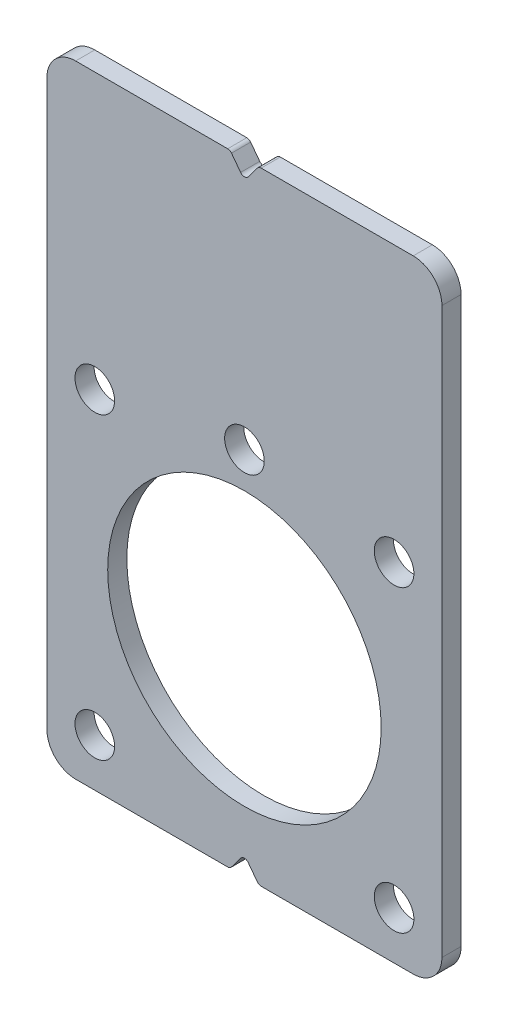
ISO-10303-21;
HEADER;
FILE_DESCRIPTION(('STEP AP214'),'2;1');
FILE_NAME('part.step','',(''),(''),'','','');
FILE_SCHEMA(('AUTOMOTIVE_DESIGN { 1 0 10303 214 1 1 1 1 }'));
ENDSEC;
DATA;
#1=APPLICATION_CONTEXT('core data for automotive mechanical design processes');
#2=APPLICATION_PROTOCOL_DEFINITION('international standard','automotive_design',2000,#1);
#3=PRODUCT_CONTEXT('',#1,'mechanical');
#4=PRODUCT('Part','Part','',(#3));
#5=PRODUCT_RELATED_PRODUCT_CATEGORY('part','',(#4));
#6=PRODUCT_DEFINITION_FORMATION('','',#4);
#7=PRODUCT_DEFINITION_CONTEXT('part definition',#1,'design');
#8=PRODUCT_DEFINITION('design','',#6,#7);
#9=PRODUCT_DEFINITION_SHAPE('','',#8);
#10=(LENGTH_UNIT() NAMED_UNIT(*) SI_UNIT(.MILLI.,.METRE.));
#11=(NAMED_UNIT(*) PLANE_ANGLE_UNIT() SI_UNIT($,.RADIAN.));
#12=(NAMED_UNIT(*) SI_UNIT($,.STERADIAN.) SOLID_ANGLE_UNIT());
#13=UNCERTAINTY_MEASURE_WITH_UNIT(LENGTH_MEASURE(1.E-05),#10,'distance_accuracy_value','');
#14=(GEOMETRIC_REPRESENTATION_CONTEXT(3) GLOBAL_UNCERTAINTY_ASSIGNED_CONTEXT((#13)) GLOBAL_UNIT_ASSIGNED_CONTEXT((#10,
#11,#12)) REPRESENTATION_CONTEXT('',''));
#15=CARTESIAN_POINT('',(0.,0.,0.));
#16=DIRECTION('',(0.,0.,1.));
#17=DIRECTION('',(1.,0.,0.));
#18=AXIS2_PLACEMENT_3D('',#15,#16,#17);
#19=CARTESIAN_POINT('',(0.,-20.6375,1.));
#20=DIRECTION('',(0.,1.,0.));
#21=DIRECTION('',(0.,0.,1.));
#22=AXIS2_PLACEMENT_3D('',#19,#20,#21);
#23=PLANE('',#22);
#24=DIRECTION('',(1.,0.,0.));
#25=VECTOR('',#24,1.);
#26=CARTESIAN_POINT('',(0.,-20.6375,-1.));
#27=LINE('',#26,#25);
#28=CARTESIAN_POINT('',(-17.6375,-20.6375,-1.));
#29=VERTEX_POINT('',#28);
#30=CARTESIAN_POINT('',(-1.74999999999999,-20.6375,-1.));
#31=VERTEX_POINT('',#30);
#32=EDGE_CURVE('E190',#29,#31,#27,.T.);
#33=ORIENTED_EDGE('',*,*,#32,.T.);
#34=DIRECTION('',(0.,0.,1.));
#35=VECTOR('',#34,1.);
#36=CARTESIAN_POINT('',(-1.74999999999999,-20.6375,1.));
#37=LINE('',#36,#35);
#38=CARTESIAN_POINT('',(-1.74999999999999,-20.6375,1.));
#39=VERTEX_POINT('',#38);
#40=EDGE_CURVE('E269',#31,#39,#37,.T.);
#41=ORIENTED_EDGE('',*,*,#40,.T.);
#42=DIRECTION('',(1.,0.,0.));
#43=VECTOR('',#42,1.);
#44=CARTESIAN_POINT('',(0.,-20.6375,1.));
#45=LINE('',#44,#43);
#46=CARTESIAN_POINT('',(-17.6375,-20.6375,1.));
#47=VERTEX_POINT('',#46);
#48=EDGE_CURVE('E193',#47,#39,#45,.T.);
#49=ORIENTED_EDGE('',*,*,#48,.F.);
#50=DIRECTION('',(0.,0.,-1.));
#51=VECTOR('',#50,1.);
#52=CARTESIAN_POINT('',(-17.6375,-20.6375,1.));
#53=LINE('',#52,#51);
#54=EDGE_CURVE('E178',#47,#29,#53,.T.);
#55=ORIENTED_EDGE('',*,*,#54,.T.);
#56=EDGE_LOOP('',(#33,#41,#49,#55));
#57=FACE_BOUND('',#56,.T.);
#58=ADVANCED_FACE('F36',(#57),#23,.F.);
#59=CARTESIAN_POINT('',(0.,44.3625,1.));
#60=DIRECTION('',(0.,1.,0.));
#61=DIRECTION('',(0.,0.,1.));
#62=AXIS2_PLACEMENT_3D('',#59,#60,#61);
#63=PLANE('',#62);
#64=DIRECTION('',(1.,0.,0.));
#65=VECTOR('',#64,1.);
#66=CARTESIAN_POINT('',(0.,44.3625,-1.));
#67=LINE('',#66,#65);
#68=CARTESIAN_POINT('',(1.74999999999999,44.3625,-1.));
#69=VERTEX_POINT('',#68);
#70=CARTESIAN_POINT('',(17.6375,44.3625,-1.));
#71=VERTEX_POINT('',#70);
#72=EDGE_CURVE('E205',#69,#71,#67,.T.);
#73=ORIENTED_EDGE('',*,*,#72,.F.);
#74=DIRECTION('',(0.,0.,1.));
#75=VECTOR('',#74,1.);
#76=CARTESIAN_POINT('',(1.74999999999999,44.3625,1.));
#77=LINE('',#76,#75);
#78=CARTESIAN_POINT('',(1.74999999999999,44.3625,1.));
#79=VERTEX_POINT('',#78);
#80=EDGE_CURVE('E275',#69,#79,#77,.T.);
#81=ORIENTED_EDGE('',*,*,#80,.T.);
#82=DIRECTION('',(1.,0.,0.));
#83=VECTOR('',#82,1.);
#84=CARTESIAN_POINT('',(0.,44.3625,1.));
#85=LINE('',#84,#83);
#86=CARTESIAN_POINT('',(17.6375,44.3625,1.));
#87=VERTEX_POINT('',#86);
#88=EDGE_CURVE('E360',#79,#87,#85,.T.);
#89=ORIENTED_EDGE('',*,*,#88,.T.);
#90=DIRECTION('',(0.,0.,-1.));
#91=VECTOR('',#90,1.);
#92=CARTESIAN_POINT('',(17.6375,44.3625,1.));
#93=LINE('',#92,#91);
#94=EDGE_CURVE('E234',#87,#71,#93,.T.);
#95=ORIENTED_EDGE('',*,*,#94,.T.);
#96=EDGE_LOOP('',(#73,#81,#89,#95));
#97=FACE_BOUND('',#96,.T.);
#98=ADVANCED_FACE('F385',(#97),#63,.T.);
#99=CARTESIAN_POINT('',(1.74999999999999,-20.6375,1.));
#100=VERTEX_POINT('',#99);
#101=CARTESIAN_POINT('',(17.6375,-20.6375,1.));
#102=VERTEX_POINT('',#101);
#103=EDGE_CURVE('E355',#100,#102,#45,.T.);
#104=ORIENTED_EDGE('',*,*,#103,.F.);
#105=DIRECTION('',(0.,0.,1.));
#106=VECTOR('',#105,1.);
#107=CARTESIAN_POINT('',(1.74999999999999,-20.6375,1.));
#108=LINE('',#107,#106);
#109=CARTESIAN_POINT('',(1.74999999999999,-20.6375,-1.));
#110=VERTEX_POINT('',#109);
#111=EDGE_CURVE('E260',#100,#110,#108,.F.);
#112=ORIENTED_EDGE('',*,*,#111,.T.);
#113=CARTESIAN_POINT('',(17.6375,-20.6375,-1.));
#114=VERTEX_POINT('',#113);
#115=EDGE_CURVE('E202',#110,#114,#27,.T.);
#116=ORIENTED_EDGE('',*,*,#115,.T.);
#117=DIRECTION('',(0.,0.,-1.));
#118=VECTOR('',#117,1.);
#119=CARTESIAN_POINT('',(17.6375,-20.6375,1.));
#120=LINE('',#119,#118);
#121=EDGE_CURVE('E242',#114,#102,#120,.F.);
#122=ORIENTED_EDGE('',*,*,#121,.T.);
#123=EDGE_LOOP('',(#104,#112,#116,#122));
#124=FACE_BOUND('',#123,.T.);
#125=ADVANCED_FACE('F387',(#124),#23,.F.);
#126=CARTESIAN_POINT('',(20.6375,0.,1.));
#127=DIRECTION('',(1.,0.,0.));
#128=DIRECTION('',(0.,1.,0.));
#129=AXIS2_PLACEMENT_3D('',#126,#127,#128);
#130=PLANE('',#129);
#131=DIRECTION('',(0.,-1.,0.));
#132=VECTOR('',#131,1.);
#133=CARTESIAN_POINT('',(20.6375,0.,-1.));
#134=LINE('',#133,#132);
#135=CARTESIAN_POINT('',(20.6375,41.3625,-1.));
#136=VERTEX_POINT('',#135);
#137=CARTESIAN_POINT('',(20.6375,-17.6375,-1.));
#138=VERTEX_POINT('',#137);
#139=EDGE_CURVE('E201',#136,#138,#134,.T.);
#140=ORIENTED_EDGE('',*,*,#139,.F.);
#141=DIRECTION('',(0.,0.,-1.));
#142=VECTOR('',#141,1.);
#143=CARTESIAN_POINT('',(20.6375,41.3625,1.));
#144=LINE('',#143,#142);
#145=CARTESIAN_POINT('',(20.6375,41.3625,1.));
#146=VERTEX_POINT('',#145);
#147=EDGE_CURVE('E240',#136,#146,#144,.F.);
#148=ORIENTED_EDGE('',*,*,#147,.T.);
#149=DIRECTION('',(0.,-1.,0.));
#150=VECTOR('',#149,1.);
#151=CARTESIAN_POINT('',(20.6375,0.,1.));
#152=LINE('',#151,#150);
#153=CARTESIAN_POINT('',(20.6375,-17.6375,1.));
#154=VERTEX_POINT('',#153);
#155=EDGE_CURVE('E357',#146,#154,#152,.T.);
#156=ORIENTED_EDGE('',*,*,#155,.T.);
#157=DIRECTION('',(0.,0.,-1.));
#158=VECTOR('',#157,1.);
#159=CARTESIAN_POINT('',(20.6375,-17.6375,-1.));
#160=LINE('',#159,#158);
#161=EDGE_CURVE('E237',#154,#138,#160,.T.);
#162=ORIENTED_EDGE('',*,*,#161,.T.);
#163=EDGE_LOOP('',(#140,#148,#156,#162));
#164=FACE_BOUND('',#163,.T.);
#165=ADVANCED_FACE('F396',(#164),#130,.T.);
#166=CARTESIAN_POINT('',(-17.6375,44.3625,1.));
#167=VERTEX_POINT('',#166);
#168=CARTESIAN_POINT('',(-1.74999999999999,44.3625,1.));
#169=VERTEX_POINT('',#168);
#170=EDGE_CURVE('E361',#167,#169,#85,.T.);
#171=ORIENTED_EDGE('',*,*,#170,.T.);
#172=DIRECTION('',(0.,0.,1.));
#173=VECTOR('',#172,1.);
#174=CARTESIAN_POINT('',(-1.74999999999999,44.3625,-1.));
#175=LINE('',#174,#173);
#176=CARTESIAN_POINT('',(-1.74999999999999,44.3625,-1.));
#177=VERTEX_POINT('',#176);
#178=EDGE_CURVE('E288',#169,#177,#175,.F.);
#179=ORIENTED_EDGE('',*,*,#178,.T.);
#180=CARTESIAN_POINT('',(-17.6375,44.3625,-1.));
#181=VERTEX_POINT('',#180);
#182=EDGE_CURVE('E211',#181,#177,#67,.T.);
#183=ORIENTED_EDGE('',*,*,#182,.F.);
#184=DIRECTION('',(0.,0.,-1.));
#185=VECTOR('',#184,1.);
#186=CARTESIAN_POINT('',(-17.6375,44.3625,1.));
#187=LINE('',#186,#185);
#188=EDGE_CURVE('E245',#181,#167,#187,.F.);
#189=ORIENTED_EDGE('',*,*,#188,.T.);
#190=EDGE_LOOP('',(#171,#179,#183,#189));
#191=FACE_BOUND('',#190,.T.);
#192=ADVANCED_FACE('F376',(#191),#63,.T.);
#193=CARTESIAN_POINT('',(0.,0.,1.));
#194=DIRECTION('',(0.,0.,-1.));
#195=DIRECTION('',(-1.,0.,0.));
#196=AXIS2_PLACEMENT_3D('',#193,#194,#195);
#197=CYLINDRICAL_SURFACE('',#196,14.2875);
#198=CARTESIAN_POINT('',(0.,0.,1.));
#199=DIRECTION('',(0.,0.,1.));
#200=DIRECTION('',(1.,0.,0.));
#201=AXIS2_PLACEMENT_3D('',#198,#199,#200);
#202=CIRCLE('',#201,14.2875);
#203=CARTESIAN_POINT('',(14.2875,0.,1.));
#204=VERTEX_POINT('',#203);
#205=EDGE_CURVE('E215',#204,#204,#202,.T.);
#206=ORIENTED_EDGE('',*,*,#205,.T.);
#207=EDGE_LOOP('',(#206));
#208=FACE_BOUND('',#207,.T.);
#209=CARTESIAN_POINT('',(0.,0.,-1.));
#210=DIRECTION('',(0.,0.,1.));
#211=DIRECTION('',(1.,0.,0.));
#212=AXIS2_PLACEMENT_3D('',#209,#210,#211);
#213=CIRCLE('',#212,14.2875);
#214=CARTESIAN_POINT('',(14.2875,0.,-1.));
#215=VERTEX_POINT('',#214);
#216=EDGE_CURVE('E207',#215,#215,#213,.T.);
#217=ORIENTED_EDGE('',*,*,#216,.F.);
#218=EDGE_LOOP('',(#217));
#219=FACE_BOUND('',#218,.T.);
#220=ADVANCED_FACE('F468',(#208,#219),#197,.F.);
#221=CARTESIAN_POINT('',(-20.6375,0.,1.));
#222=DIRECTION('',(1.,0.,0.));
#223=DIRECTION('',(0.,1.,0.));
#224=AXIS2_PLACEMENT_3D('',#221,#222,#223);
#225=PLANE('',#224);
#226=DIRECTION('',(0.,-1.,0.));
#227=VECTOR('',#226,1.);
#228=CARTESIAN_POINT('',(-20.6375,0.,-1.));
#229=LINE('',#228,#227);
#230=CARTESIAN_POINT('',(-20.6375,41.3625,-1.));
#231=VERTEX_POINT('',#230);
#232=CARTESIAN_POINT('',(-20.6375,-17.6375,-1.));
#233=VERTEX_POINT('',#232);
#234=EDGE_CURVE('E214',#231,#233,#229,.T.);
#235=ORIENTED_EDGE('',*,*,#234,.T.);
#236=DIRECTION('',(0.,0.,-1.));
#237=VECTOR('',#236,1.);
#238=CARTESIAN_POINT('',(-20.6375,-17.6375,1.));
#239=LINE('',#238,#237);
#240=CARTESIAN_POINT('',(-20.6375,-17.6375,1.));
#241=VERTEX_POINT('',#240);
#242=EDGE_CURVE('E179',#233,#241,#239,.F.);
#243=ORIENTED_EDGE('',*,*,#242,.T.);
#244=DIRECTION('',(0.,-1.,0.));
#245=VECTOR('',#244,1.);
#246=CARTESIAN_POINT('',(-20.6375,0.,1.));
#247=LINE('',#246,#245);
#248=CARTESIAN_POINT('',(-20.6375,41.3625,1.));
#249=VERTEX_POINT('',#248);
#250=EDGE_CURVE('E195',#249,#241,#247,.T.);
#251=ORIENTED_EDGE('',*,*,#250,.F.);
#252=DIRECTION('',(0.,0.,-1.));
#253=VECTOR('',#252,1.);
#254=CARTESIAN_POINT('',(-20.6375,41.3625,-1.));
#255=LINE('',#254,#253);
#256=EDGE_CURVE('E183',#249,#231,#255,.T.);
#257=ORIENTED_EDGE('',*,*,#256,.T.);
#258=EDGE_LOOP('',(#235,#243,#251,#257));
#259=FACE_BOUND('',#258,.T.);
#260=ADVANCED_FACE('F369',(#259),#225,.F.);
#261=CARTESIAN_POINT('',(0.,0.,1.));
#262=DIRECTION('',(0.,0.,1.));
#263=DIRECTION('',(1.,0.,0.));
#264=AXIS2_PLACEMENT_3D('',#261,#262,#263);
#265=PLANE('',#264);
#266=CARTESIAN_POINT('',(15.6375,-15.6375,1.));
#267=DIRECTION('',(0.,0.,1.));
#268=DIRECTION('',(1.,0.,0.));
#269=AXIS2_PLACEMENT_3D('',#266,#267,#268);
#270=CIRCLE('',#269,2.07);
#271=CARTESIAN_POINT('',(17.7075,-15.6375,1.));
#272=VERTEX_POINT('',#271);
#273=EDGE_CURVE('E350',#272,#272,#270,.T.);
#274=ORIENTED_EDGE('',*,*,#273,.F.);
#275=EDGE_LOOP('',(#274));
#276=FACE_BOUND('',#275,.T.);
#277=DIRECTION('',(-0.599999999999998,0.800000000000001,0.));
#278=VECTOR('',#277,1.);
#279=CARTESIAN_POINT('',(-8.94599999999999,-6.70949999999996,1.));
#280=LINE('',#279,#278);
#281=CARTESIAN_POINT('',(1.34999999999999,-20.4375,1.));
#282=VERTEX_POINT('',#281);
#283=CARTESIAN_POINT('',(0.400000000000001,-19.1708333333333,1.));
#284=VERTEX_POINT('',#283);
#285=EDGE_CURVE('E345',#282,#284,#280,.T.);
#286=ORIENTED_EDGE('',*,*,#285,.F.);
#287=CARTESIAN_POINT('',(1.74999999999999,-20.1375,1.));
#288=DIRECTION('',(0.,0.,1.));
#289=DIRECTION('',(1.,0.,0.));
#290=AXIS2_PLACEMENT_3D('',#287,#288,#289);
#291=CIRCLE('',#290,0.5);
#292=EDGE_CURVE('E258',#282,#100,#291,.T.);
#293=ORIENTED_EDGE('',*,*,#292,.T.);
#294=ORIENTED_EDGE('',*,*,#103,.T.);
#295=CARTESIAN_POINT('',(17.6375,-17.6375,1.));
#296=DIRECTION('',(0.,0.,1.));
#297=DIRECTION('',(1.,0.,0.));
#298=AXIS2_PLACEMENT_3D('',#295,#296,#297);
#299=CIRCLE('',#298,3.);
#300=EDGE_CURVE('E227',#102,#154,#299,.T.);
#301=ORIENTED_EDGE('',*,*,#300,.T.);
#302=ORIENTED_EDGE('',*,*,#155,.F.);
#303=CARTESIAN_POINT('',(17.6375,41.3625,1.));
#304=DIRECTION('',(0.,0.,1.));
#305=DIRECTION('',(1.,0.,0.));
#306=AXIS2_PLACEMENT_3D('',#303,#304,#305);
#307=CIRCLE('',#306,3.);
#308=EDGE_CURVE('E229',#146,#87,#307,.T.);
#309=ORIENTED_EDGE('',*,*,#308,.T.);
#310=ORIENTED_EDGE('',*,*,#88,.F.);
#311=CARTESIAN_POINT('',(1.74999999999999,43.8625,1.));
#312=DIRECTION('',(0.,0.,1.));
#313=DIRECTION('',(1.,0.,0.));
#314=AXIS2_PLACEMENT_3D('',#311,#312,#313);
#315=CIRCLE('',#314,0.5);
#316=CARTESIAN_POINT('',(1.35,44.1625,1.));
#317=VERTEX_POINT('',#316);
#318=EDGE_CURVE('E254',#79,#317,#315,.T.);
#319=ORIENTED_EDGE('',*,*,#318,.T.);
#320=DIRECTION('',(0.599999999999998,0.800000000000001,0.));
#321=VECTOR('',#320,1.);
#322=CARTESIAN_POINT('',(-20.334,15.2504999999999,1.));
#323=LINE('',#322,#321);
#324=CARTESIAN_POINT('',(0.400000000000008,42.8958333333333,1.));
#325=VERTEX_POINT('',#324);
#326=EDGE_CURVE('E301',#325,#317,#323,.T.);
#327=ORIENTED_EDGE('',*,*,#326,.F.);
#328=CARTESIAN_POINT('',(0.,43.1958333333333,1.));
#329=DIRECTION('',(0.,0.,1.));
#330=DIRECTION('',(1.,0.,0.));
#331=AXIS2_PLACEMENT_3D('',#328,#329,#330);
#332=CIRCLE('',#331,0.5);
#333=CARTESIAN_POINT('',(-0.400000000000005,42.8958333333333,1.));
#334=VERTEX_POINT('',#333);
#335=EDGE_CURVE('E44',#325,#334,#332,.F.);
#336=ORIENTED_EDGE('',*,*,#335,.T.);
#337=DIRECTION('',(0.599999999999998,-0.800000000000001,0.));
#338=VECTOR('',#337,1.);
#339=CARTESIAN_POINT('',(20.334,15.2504999999999,1.));
#340=LINE('',#339,#338);
#341=CARTESIAN_POINT('',(-1.34999999999999,44.1625,1.));
#342=VERTEX_POINT('',#341);
#343=EDGE_CURVE('E299',#342,#334,#340,.T.);
#344=ORIENTED_EDGE('',*,*,#343,.F.);
#345=CARTESIAN_POINT('',(-1.74999999999999,43.8625,1.));
#346=DIRECTION('',(0.,0.,1.));
#347=DIRECTION('',(1.,0.,0.));
#348=AXIS2_PLACEMENT_3D('',#345,#346,#347);
#349=CIRCLE('',#348,0.5);
#350=EDGE_CURVE('E252',#342,#169,#349,.T.);
#351=ORIENTED_EDGE('',*,*,#350,.T.);
#352=ORIENTED_EDGE('',*,*,#170,.F.);
#353=CARTESIAN_POINT('',(-17.6375,41.3625,1.));
#354=DIRECTION('',(0.,0.,1.));
#355=DIRECTION('',(1.,0.,0.));
#356=AXIS2_PLACEMENT_3D('',#353,#354,#355);
#357=CIRCLE('',#356,3.);
#358=EDGE_CURVE('E225',#167,#249,#357,.T.);
#359=ORIENTED_EDGE('',*,*,#358,.T.);
#360=ORIENTED_EDGE('',*,*,#250,.T.);
#361=CARTESIAN_POINT('',(-17.6375,-17.6375,1.));
#362=DIRECTION('',(0.,0.,1.));
#363=DIRECTION('',(1.,0.,0.));
#364=AXIS2_PLACEMENT_3D('',#361,#362,#363);
#365=CIRCLE('',#364,3.);
#366=EDGE_CURVE('E232',#241,#47,#365,.T.);
#367=ORIENTED_EDGE('',*,*,#366,.T.);
#368=ORIENTED_EDGE('',*,*,#48,.T.);
#369=CARTESIAN_POINT('',(-1.74999999999999,-20.1375,1.));
#370=DIRECTION('',(0.,0.,1.));
#371=DIRECTION('',(1.,0.,0.));
#372=AXIS2_PLACEMENT_3D('',#369,#370,#371);
#373=CIRCLE('',#372,0.5);
#374=CARTESIAN_POINT('',(-1.34999999999999,-20.4375,1.));
#375=VERTEX_POINT('',#374);
#376=EDGE_CURVE('E256',#39,#375,#373,.T.);
#377=ORIENTED_EDGE('',*,*,#376,.T.);
#378=DIRECTION('',(-0.599999999999998,-0.800000000000001,0.));
#379=VECTOR('',#378,1.);
#380=CARTESIAN_POINT('',(8.94599999999999,-6.70949999999997,1.));
#381=LINE('',#380,#379);
#382=CARTESIAN_POINT('',(-0.400000000000001,-19.1708333333333,1.));
#383=VERTEX_POINT('',#382);
#384=EDGE_CURVE('E348',#383,#375,#381,.T.);
#385=ORIENTED_EDGE('',*,*,#384,.F.);
#386=CARTESIAN_POINT('',(0.,-19.4708333333333,1.));
#387=DIRECTION('',(0.,0.,1.));
#388=DIRECTION('',(1.,0.,0.));
#389=AXIS2_PLACEMENT_3D('',#386,#387,#388);
#390=CIRCLE('',#389,0.5);
#391=EDGE_CURVE('E290',#383,#284,#390,.F.);
#392=ORIENTED_EDGE('',*,*,#391,.T.);
#393=EDGE_LOOP('',(#286,#293,#294,#301,#302,#309,#310,#319,#327,#336,#344,#351,#352,#359,#360,
#367,#368,#377,#385,#392));
#394=FACE_BOUND('',#393,.T.);
#395=CARTESIAN_POINT('',(-15.6375,-15.6375,1.));
#396=DIRECTION('',(0.,0.,1.));
#397=DIRECTION('',(1.,0.,0.));
#398=AXIS2_PLACEMENT_3D('',#395,#396,#397);
#399=CIRCLE('',#398,2.07);
#400=CARTESIAN_POINT('',(-13.5675,-15.6375,1.));
#401=VERTEX_POINT('',#400);
#402=EDGE_CURVE('E342',#401,#401,#399,.T.);
#403=ORIENTED_EDGE('',*,*,#402,.F.);
#404=EDGE_LOOP('',(#403));
#405=FACE_BOUND('',#404,.T.);
#406=CARTESIAN_POINT('',(15.6375,15.6375,1.));
#407=DIRECTION('',(0.,0.,1.));
#408=DIRECTION('',(1.,0.,0.));
#409=AXIS2_PLACEMENT_3D('',#406,#407,#408);
#410=CIRCLE('',#409,2.07);
#411=CARTESIAN_POINT('',(17.7075,15.6375,1.));
#412=VERTEX_POINT('',#411);
#413=EDGE_CURVE('E310',#412,#412,#410,.T.);
#414=ORIENTED_EDGE('',*,*,#413,.F.);
#415=EDGE_LOOP('',(#414));
#416=FACE_BOUND('',#415,.T.);
#417=CARTESIAN_POINT('',(-15.6375,15.6375,1.));
#418=DIRECTION('',(0.,0.,1.));
#419=DIRECTION('',(1.,0.,0.));
#420=AXIS2_PLACEMENT_3D('',#417,#418,#419);
#421=CIRCLE('',#420,2.07);
#422=CARTESIAN_POINT('',(-13.5675,15.6375,1.));
#423=VERTEX_POINT('',#422);
#424=EDGE_CURVE('E336',#423,#423,#421,.T.);
#425=ORIENTED_EDGE('',*,*,#424,.F.);
#426=EDGE_LOOP('',(#425));
#427=FACE_BOUND('',#426,.T.);
#428=CARTESIAN_POINT('',(0.,18.,1.));
#429=DIRECTION('',(0.,0.,1.));
#430=DIRECTION('',(1.,0.,0.));
#431=AXIS2_PLACEMENT_3D('',#428,#429,#430);
#432=CIRCLE('',#431,2.07);
#433=CARTESIAN_POINT('',(2.07,18.,1.));
#434=VERTEX_POINT('',#433);
#435=EDGE_CURVE('E325',#434,#434,#432,.T.);
#436=ORIENTED_EDGE('',*,*,#435,.F.);
#437=EDGE_LOOP('',(#436));
#438=FACE_BOUND('',#437,.T.);
#439=ORIENTED_EDGE('',*,*,#205,.F.);
#440=EDGE_LOOP('',(#439));
#441=FACE_BOUND('',#440,.T.);
#442=ADVANCED_FACE('F297',(#276,#394,#405,#416,#427,#438,#441),#265,.T.);
#443=CARTESIAN_POINT('',(0.,0.,-1.));
#444=DIRECTION('',(0.,0.,1.));
#445=DIRECTION('',(1.,0.,0.));
#446=AXIS2_PLACEMENT_3D('',#443,#444,#445);
#447=PLANE('',#446);
#448=CARTESIAN_POINT('',(15.6375,-15.6375,-1.));
#449=DIRECTION('',(0.,0.,1.));
#450=DIRECTION('',(-1.,0.,0.));
#451=AXIS2_PLACEMENT_3D('',#448,#449,#450);
#452=CIRCLE('',#451,2.07);
#453=CARTESIAN_POINT('',(13.5675,-15.6375,-1.));
#454=VERTEX_POINT('',#453);
#455=EDGE_CURVE('E415',#454,#454,#452,.T.);
#456=ORIENTED_EDGE('',*,*,#455,.T.);
#457=EDGE_LOOP('',(#456));
#458=FACE_BOUND('',#457,.T.);
#459=CARTESIAN_POINT('',(-15.6375,-15.6375,-1.));
#460=DIRECTION('',(0.,0.,1.));
#461=DIRECTION('',(1.,0.,0.));
#462=AXIS2_PLACEMENT_3D('',#459,#460,#461);
#463=CIRCLE('',#462,2.07);
#464=CARTESIAN_POINT('',(-13.5675,-15.6375,-1.));
#465=VERTEX_POINT('',#464);
#466=EDGE_CURVE('E327',#465,#465,#463,.T.);
#467=ORIENTED_EDGE('',*,*,#466,.T.);
#468=EDGE_LOOP('',(#467));
#469=FACE_BOUND('',#468,.T.);
#470=CARTESIAN_POINT('',(15.6375,15.6375,-1.));
#471=DIRECTION('',(0.,0.,1.));
#472=DIRECTION('',(1.,0.,0.));
#473=AXIS2_PLACEMENT_3D('',#470,#471,#472);
#474=CIRCLE('',#473,2.07);
#475=CARTESIAN_POINT('',(17.7075,15.6375,-1.));
#476=VERTEX_POINT('',#475);
#477=EDGE_CURVE('E419',#476,#476,#474,.T.);
#478=ORIENTED_EDGE('',*,*,#477,.T.);
#479=EDGE_LOOP('',(#478));
#480=FACE_BOUND('',#479,.T.);
#481=CARTESIAN_POINT('',(-15.6375,15.6375,-1.));
#482=DIRECTION('',(0.,0.,1.));
#483=DIRECTION('',(-1.,0.,0.));
#484=AXIS2_PLACEMENT_3D('',#481,#482,#483);
#485=CIRCLE('',#484,2.07);
#486=CARTESIAN_POINT('',(-17.7075,15.6375,-1.));
#487=VERTEX_POINT('',#486);
#488=EDGE_CURVE('E421',#487,#487,#485,.T.);
#489=ORIENTED_EDGE('',*,*,#488,.T.);
#490=EDGE_LOOP('',(#489));
#491=FACE_BOUND('',#490,.T.);
#492=CARTESIAN_POINT('',(0.,18.,-1.));
#493=DIRECTION('',(0.,0.,1.));
#494=DIRECTION('',(1.,0.,0.));
#495=AXIS2_PLACEMENT_3D('',#492,#493,#494);
#496=CIRCLE('',#495,2.07);
#497=CARTESIAN_POINT('',(2.07,18.,-1.));
#498=VERTEX_POINT('',#497);
#499=EDGE_CURVE('E322',#498,#498,#496,.T.);
#500=ORIENTED_EDGE('',*,*,#499,.T.);
#501=EDGE_LOOP('',(#500));
#502=FACE_BOUND('',#501,.T.);
#503=ORIENTED_EDGE('',*,*,#216,.T.);
#504=EDGE_LOOP('',(#503));
#505=FACE_BOUND('',#504,.T.);
#506=ORIENTED_EDGE('',*,*,#115,.F.);
#507=CARTESIAN_POINT('',(1.74999999999999,-20.1375,-1.));
#508=DIRECTION('',(0.,0.,1.));
#509=DIRECTION('',(1.,0.,0.));
#510=AXIS2_PLACEMENT_3D('',#507,#508,#509);
#511=CIRCLE('',#510,0.5);
#512=CARTESIAN_POINT('',(1.34999999999999,-20.4375,-1.));
#513=VERTEX_POINT('',#512);
#514=EDGE_CURVE('E267',#110,#513,#511,.F.);
#515=ORIENTED_EDGE('',*,*,#514,.T.);
#516=DIRECTION('',(-0.599999999999998,0.800000000000001,0.));
#517=VECTOR('',#516,1.);
#518=CARTESIAN_POINT('',(1.5,-20.6375,-1.));
#519=LINE('',#518,#517);
#520=CARTESIAN_POINT('',(0.400000000000001,-19.1708333333333,-1.));
#521=VERTEX_POINT('',#520);
#522=EDGE_CURVE('E411',#513,#521,#519,.T.);
#523=ORIENTED_EDGE('',*,*,#522,.T.);
#524=CARTESIAN_POINT('',(0.,-19.4708333333333,-1.));
#525=DIRECTION('',(0.,0.,1.));
#526=DIRECTION('',(1.,0.,0.));
#527=AXIS2_PLACEMENT_3D('',#524,#525,#526);
#528=CIRCLE('',#527,0.5);
#529=CARTESIAN_POINT('',(-0.400000000000001,-19.1708333333333,-1.));
#530=VERTEX_POINT('',#529);
#531=EDGE_CURVE('E58',#521,#530,#528,.T.);
#532=ORIENTED_EDGE('',*,*,#531,.T.);
#533=DIRECTION('',(-0.599999999999998,-0.800000000000001,0.));
#534=VECTOR('',#533,1.);
#535=CARTESIAN_POINT('',(-1.5,-20.6375,-1.));
#536=LINE('',#535,#534);
#537=CARTESIAN_POINT('',(-1.34999999999999,-20.4375,-1.));
#538=VERTEX_POINT('',#537);
#539=EDGE_CURVE('E332',#530,#538,#536,.T.);
#540=ORIENTED_EDGE('',*,*,#539,.T.);
#541=CARTESIAN_POINT('',(-1.74999999999999,-20.1375,-1.));
#542=DIRECTION('',(0.,0.,1.));
#543=DIRECTION('',(1.,0.,0.));
#544=AXIS2_PLACEMENT_3D('',#541,#542,#543);
#545=CIRCLE('',#544,0.5);
#546=EDGE_CURVE('E200',#538,#31,#545,.F.);
#547=ORIENTED_EDGE('',*,*,#546,.T.);
#548=ORIENTED_EDGE('',*,*,#32,.F.);
#549=CARTESIAN_POINT('',(-17.6375,-17.6375,-1.));
#550=DIRECTION('',(0.,0.,1.));
#551=DIRECTION('',(1.,0.,0.));
#552=AXIS2_PLACEMENT_3D('',#549,#550,#551);
#553=CIRCLE('',#552,3.);
#554=EDGE_CURVE('E174',#29,#233,#553,.F.);
#555=ORIENTED_EDGE('',*,*,#554,.T.);
#556=ORIENTED_EDGE('',*,*,#234,.F.);
#557=CARTESIAN_POINT('',(-17.6375,41.3625,-1.));
#558=DIRECTION('',(0.,0.,1.));
#559=DIRECTION('',(1.,0.,0.));
#560=AXIS2_PLACEMENT_3D('',#557,#558,#559);
#561=CIRCLE('',#560,3.);
#562=EDGE_CURVE('E194',#231,#181,#561,.F.);
#563=ORIENTED_EDGE('',*,*,#562,.T.);
#564=ORIENTED_EDGE('',*,*,#182,.T.);
#565=CARTESIAN_POINT('',(-1.74999999999999,43.8625,-1.));
#566=DIRECTION('',(0.,0.,1.));
#567=DIRECTION('',(1.,0.,0.));
#568=AXIS2_PLACEMENT_3D('',#565,#566,#567);
#569=CIRCLE('',#568,0.5);
#570=CARTESIAN_POINT('',(-1.34999999999999,44.1625,-1.));
#571=VERTEX_POINT('',#570);
#572=EDGE_CURVE('E262',#177,#571,#569,.F.);
#573=ORIENTED_EDGE('',*,*,#572,.T.);
#574=DIRECTION('',(0.599999999999998,-0.800000000000001,0.));
#575=VECTOR('',#574,1.);
#576=CARTESIAN_POINT('',(-1.5,44.3625,-1.));
#577=LINE('',#576,#575);
#578=CARTESIAN_POINT('',(-0.400000000000001,42.8958333333333,-1.));
#579=VERTEX_POINT('',#578);
#580=EDGE_CURVE('E318',#571,#579,#577,.T.);
#581=ORIENTED_EDGE('',*,*,#580,.T.);
#582=CARTESIAN_POINT('',(0.,43.1958333333333,-1.));
#583=DIRECTION('',(0.,0.,1.));
#584=DIRECTION('',(1.,0.,0.));
#585=AXIS2_PLACEMENT_3D('',#582,#583,#584);
#586=CIRCLE('',#585,0.5);
#587=CARTESIAN_POINT('',(0.400000000000001,42.8958333333333,-1.));
#588=VERTEX_POINT('',#587);
#589=EDGE_CURVE('E11',#579,#588,#586,.T.);
#590=ORIENTED_EDGE('',*,*,#589,.T.);
#591=DIRECTION('',(0.599999999999998,0.800000000000001,0.));
#592=VECTOR('',#591,1.);
#593=CARTESIAN_POINT('',(1.5,44.3625,-1.));
#594=LINE('',#593,#592);
#595=CARTESIAN_POINT('',(1.34999999999999,44.1625,-1.));
#596=VERTEX_POINT('',#595);
#597=EDGE_CURVE('E316',#588,#596,#594,.T.);
#598=ORIENTED_EDGE('',*,*,#597,.T.);
#599=CARTESIAN_POINT('',(1.74999999999999,43.8625,-1.));
#600=DIRECTION('',(0.,0.,1.));
#601=DIRECTION('',(1.,0.,0.));
#602=AXIS2_PLACEMENT_3D('',#599,#600,#601);
#603=CIRCLE('',#602,0.5);
#604=EDGE_CURVE('E264',#596,#69,#603,.F.);
#605=ORIENTED_EDGE('',*,*,#604,.T.);
#606=ORIENTED_EDGE('',*,*,#72,.T.);
#607=CARTESIAN_POINT('',(17.6375,41.3625,-1.));
#608=DIRECTION('',(0.,0.,1.));
#609=DIRECTION('',(1.,0.,0.));
#610=AXIS2_PLACEMENT_3D('',#607,#608,#609);
#611=CIRCLE('',#610,3.);
#612=EDGE_CURVE('E184',#71,#136,#611,.F.);
#613=ORIENTED_EDGE('',*,*,#612,.T.);
#614=ORIENTED_EDGE('',*,*,#139,.T.);
#615=CARTESIAN_POINT('',(17.6375,-17.6375,-1.));
#616=DIRECTION('',(0.,0.,1.));
#617=DIRECTION('',(1.,0.,0.));
#618=AXIS2_PLACEMENT_3D('',#615,#616,#617);
#619=CIRCLE('',#618,3.);
#620=EDGE_CURVE('E218',#138,#114,#619,.F.);
#621=ORIENTED_EDGE('',*,*,#620,.T.);
#622=EDGE_LOOP('',(#506,#515,#523,#532,#540,#547,#548,#555,#556,#563,#564,#573,#581,#590,#598,
#605,#606,#613,#614,#621));
#623=FACE_BOUND('',#622,.T.);
#624=ADVANCED_FACE('F198',(#458,#469,#480,#491,#502,#505,#623),#447,.F.);
#625=CARTESIAN_POINT('',(0.,18.,-1.));
#626=DIRECTION('',(0.,0.,1.));
#627=DIRECTION('',(1.,0.,0.));
#628=AXIS2_PLACEMENT_3D('',#625,#626,#627);
#629=CYLINDRICAL_SURFACE('',#628,2.07);
#630=ORIENTED_EDGE('',*,*,#435,.T.);
#631=EDGE_LOOP('',(#630));
#632=FACE_BOUND('',#631,.T.);
#633=ORIENTED_EDGE('',*,*,#499,.F.);
#634=EDGE_LOOP('',(#633));
#635=FACE_BOUND('',#634,.T.);
#636=ADVANCED_FACE('F439',(#632,#635),#629,.F.);
#637=CARTESIAN_POINT('',(-15.6375,15.6375,-1.));
#638=DIRECTION('',(0.,0.,1.));
#639=DIRECTION('',(1.,0.,0.));
#640=AXIS2_PLACEMENT_3D('',#637,#638,#639);
#641=CYLINDRICAL_SURFACE('',#640,2.07);
#642=ORIENTED_EDGE('',*,*,#424,.T.);
#643=EDGE_LOOP('',(#642));
#644=FACE_BOUND('',#643,.T.);
#645=ORIENTED_EDGE('',*,*,#488,.F.);
#646=EDGE_LOOP('',(#645));
#647=FACE_BOUND('',#646,.T.);
#648=ADVANCED_FACE('F431',(#644,#647),#641,.F.);
#649=CARTESIAN_POINT('',(15.6375,15.6375,-1.));
#650=DIRECTION('',(0.,0.,1.));
#651=DIRECTION('',(1.,0.,0.));
#652=AXIS2_PLACEMENT_3D('',#649,#650,#651);
#653=CYLINDRICAL_SURFACE('',#652,2.07);
#654=ORIENTED_EDGE('',*,*,#413,.T.);
#655=EDGE_LOOP('',(#654));
#656=FACE_BOUND('',#655,.T.);
#657=ORIENTED_EDGE('',*,*,#477,.F.);
#658=EDGE_LOOP('',(#657));
#659=FACE_BOUND('',#658,.T.);
#660=ADVANCED_FACE('F429',(#656,#659),#653,.F.);
#661=CARTESIAN_POINT('',(1.5,44.3625,-1.));
#662=DIRECTION('',(0.800000000000001,-0.599999999999998,0.));
#663=DIRECTION('',(0.599999999999998,0.800000000000001,0.));
#664=AXIS2_PLACEMENT_3D('',#661,#662,#663);
#665=PLANE('',#664);
#666=ORIENTED_EDGE('',*,*,#326,.T.);
#667=DIRECTION('',(0.,0.,1.));
#668=VECTOR('',#667,1.);
#669=CARTESIAN_POINT('',(1.34999999999999,44.1625,-0.999999999999999));
#670=LINE('',#669,#668);
#671=EDGE_CURVE('E281',#317,#596,#670,.F.);
#672=ORIENTED_EDGE('',*,*,#671,.T.);
#673=ORIENTED_EDGE('',*,*,#597,.F.);
#674=DIRECTION('',(0.,0.,1.));
#675=VECTOR('',#674,1.);
#676=CARTESIAN_POINT('',(0.400000000000002,42.8958333333333,1.));
#677=LINE('',#676,#675);
#678=EDGE_CURVE('E278',#588,#325,#677,.T.);
#679=ORIENTED_EDGE('',*,*,#678,.T.);
#680=EDGE_LOOP('',(#666,#672,#673,#679));
#681=FACE_BOUND('',#680,.T.);
#682=ADVANCED_FACE('F320',(#681),#665,.F.);
#683=CARTESIAN_POINT('',(-1.5,44.3625,-1.));
#684=DIRECTION('',(-0.800000000000001,-0.599999999999998,0.));
#685=DIRECTION('',(0.599999999999998,-0.800000000000001,0.));
#686=AXIS2_PLACEMENT_3D('',#683,#684,#685);
#687=PLANE('',#686);
#688=ORIENTED_EDGE('',*,*,#343,.T.);
#689=DIRECTION('',(0.,0.,1.));
#690=VECTOR('',#689,1.);
#691=CARTESIAN_POINT('',(-0.400000000000002,42.8958333333333,-1.));
#692=LINE('',#691,#690);
#693=EDGE_CURVE('E286',#334,#579,#692,.F.);
#694=ORIENTED_EDGE('',*,*,#693,.T.);
#695=ORIENTED_EDGE('',*,*,#580,.F.);
#696=DIRECTION('',(0.,0.,1.));
#697=VECTOR('',#696,1.);
#698=CARTESIAN_POINT('',(-1.34999999999999,44.1625,1.));
#699=LINE('',#698,#697);
#700=EDGE_CURVE('E283',#571,#342,#699,.T.);
#701=ORIENTED_EDGE('',*,*,#700,.T.);
#702=EDGE_LOOP('',(#688,#694,#695,#701));
#703=FACE_BOUND('',#702,.T.);
#704=ADVANCED_FACE('F306',(#703),#687,.F.);
#705=CARTESIAN_POINT('',(-15.6375,-15.6375,-1.));
#706=DIRECTION('',(0.,0.,1.));
#707=DIRECTION('',(1.,0.,0.));
#708=AXIS2_PLACEMENT_3D('',#705,#706,#707);
#709=CYLINDRICAL_SURFACE('',#708,2.07);
#710=ORIENTED_EDGE('',*,*,#402,.T.);
#711=EDGE_LOOP('',(#710));
#712=FACE_BOUND('',#711,.T.);
#713=ORIENTED_EDGE('',*,*,#466,.F.);
#714=EDGE_LOOP('',(#713));
#715=FACE_BOUND('',#714,.T.);
#716=ADVANCED_FACE('F446',(#712,#715),#709,.F.);
#717=CARTESIAN_POINT('',(-1.5,-20.6375,-1.));
#718=DIRECTION('',(-0.800000000000001,0.599999999999998,0.));
#719=DIRECTION('',(-0.599999999999998,-0.800000000000001,0.));
#720=AXIS2_PLACEMENT_3D('',#717,#718,#719);
#721=PLANE('',#720);
#722=ORIENTED_EDGE('',*,*,#384,.T.);
#723=DIRECTION('',(0.,0.,1.));
#724=VECTOR('',#723,1.);
#725=CARTESIAN_POINT('',(-1.34999999999999,-20.4375,-1.));
#726=LINE('',#725,#724);
#727=EDGE_CURVE('E51',#375,#538,#726,.F.);
#728=ORIENTED_EDGE('',*,*,#727,.T.);
#729=ORIENTED_EDGE('',*,*,#539,.F.);
#730=DIRECTION('',(0.,0.,1.));
#731=VECTOR('',#730,1.);
#732=CARTESIAN_POINT('',(-0.4,-19.1708333333333,1.));
#733=LINE('',#732,#731);
#734=EDGE_CURVE('E271',#530,#383,#733,.T.);
#735=ORIENTED_EDGE('',*,*,#734,.T.);
#736=EDGE_LOOP('',(#722,#728,#729,#735));
#737=FACE_BOUND('',#736,.T.);
#738=ADVANCED_FACE('F443',(#737),#721,.F.);
#739=CARTESIAN_POINT('',(1.5,-20.6375,-1.));
#740=DIRECTION('',(0.800000000000001,0.599999999999998,0.));
#741=DIRECTION('',(-0.599999999999998,0.800000000000001,0.));
#742=AXIS2_PLACEMENT_3D('',#739,#740,#741);
#743=PLANE('',#742);
#744=ORIENTED_EDGE('',*,*,#522,.F.);
#745=DIRECTION('',(0.,0.,1.));
#746=VECTOR('',#745,1.);
#747=CARTESIAN_POINT('',(1.34999999999999,-20.4375,-1.));
#748=LINE('',#747,#746);
#749=EDGE_CURVE('E249',#513,#282,#748,.T.);
#750=ORIENTED_EDGE('',*,*,#749,.T.);
#751=ORIENTED_EDGE('',*,*,#285,.T.);
#752=DIRECTION('',(0.,0.,1.));
#753=VECTOR('',#752,1.);
#754=CARTESIAN_POINT('',(0.400000000000001,-19.1708333333333,-1.));
#755=LINE('',#754,#753);
#756=EDGE_CURVE('E247',#284,#521,#755,.F.);
#757=ORIENTED_EDGE('',*,*,#756,.T.);
#758=EDGE_LOOP('',(#744,#750,#751,#757));
#759=FACE_BOUND('',#758,.T.);
#760=ADVANCED_FACE('F413',(#759),#743,.F.);
#761=CARTESIAN_POINT('',(15.6375,-15.6375,-1.));
#762=DIRECTION('',(0.,0.,1.));
#763=DIRECTION('',(1.,0.,0.));
#764=AXIS2_PLACEMENT_3D('',#761,#762,#763);
#765=CYLINDRICAL_SURFACE('',#764,2.07);
#766=ORIENTED_EDGE('',*,*,#273,.T.);
#767=EDGE_LOOP('',(#766));
#768=FACE_BOUND('',#767,.T.);
#769=ORIENTED_EDGE('',*,*,#455,.F.);
#770=EDGE_LOOP('',(#769));
#771=FACE_BOUND('',#770,.T.);
#772=ADVANCED_FACE('F449',(#768,#771),#765,.F.);
#773=CARTESIAN_POINT('',(-17.6375,-17.6375,1.));
#774=DIRECTION('',(0.,0.,-1.));
#775=DIRECTION('',(-1.,0.,0.));
#776=AXIS2_PLACEMENT_3D('',#773,#774,#775);
#777=CYLINDRICAL_SURFACE('',#776,3.);
#778=ORIENTED_EDGE('',*,*,#366,.F.);
#779=ORIENTED_EDGE('',*,*,#242,.F.);
#780=ORIENTED_EDGE('',*,*,#554,.F.);
#781=ORIENTED_EDGE('',*,*,#54,.F.);
#782=EDGE_LOOP('',(#778,#779,#780,#781));
#783=FACE_BOUND('',#782,.T.);
#784=ADVANCED_FACE('F177',(#783),#777,.T.);
#785=CARTESIAN_POINT('',(17.6375,41.3625,1.));
#786=DIRECTION('',(0.,0.,-1.));
#787=DIRECTION('',(-1.,0.,0.));
#788=AXIS2_PLACEMENT_3D('',#785,#786,#787);
#789=CYLINDRICAL_SURFACE('',#788,3.);
#790=ORIENTED_EDGE('',*,*,#308,.F.);
#791=ORIENTED_EDGE('',*,*,#147,.F.);
#792=ORIENTED_EDGE('',*,*,#612,.F.);
#793=ORIENTED_EDGE('',*,*,#94,.F.);
#794=EDGE_LOOP('',(#790,#791,#792,#793));
#795=FACE_BOUND('',#794,.T.);
#796=ADVANCED_FACE('F480',(#795),#789,.T.);
#797=CARTESIAN_POINT('',(17.6375,-17.6375,1.));
#798=DIRECTION('',(0.,0.,1.));
#799=DIRECTION('',(1.,0.,0.));
#800=AXIS2_PLACEMENT_3D('',#797,#798,#799);
#801=CYLINDRICAL_SURFACE('',#800,3.);
#802=ORIENTED_EDGE('',*,*,#300,.F.);
#803=ORIENTED_EDGE('',*,*,#121,.F.);
#804=ORIENTED_EDGE('',*,*,#620,.F.);
#805=ORIENTED_EDGE('',*,*,#161,.F.);
#806=EDGE_LOOP('',(#802,#803,#804,#805));
#807=FACE_BOUND('',#806,.T.);
#808=ADVANCED_FACE('F483',(#807),#801,.T.);
#809=CARTESIAN_POINT('',(-17.6375,41.3625,1.));
#810=DIRECTION('',(0.,0.,1.));
#811=DIRECTION('',(1.,0.,0.));
#812=AXIS2_PLACEMENT_3D('',#809,#810,#811);
#813=CYLINDRICAL_SURFACE('',#812,3.);
#814=ORIENTED_EDGE('',*,*,#358,.F.);
#815=ORIENTED_EDGE('',*,*,#188,.F.);
#816=ORIENTED_EDGE('',*,*,#562,.F.);
#817=ORIENTED_EDGE('',*,*,#256,.F.);
#818=EDGE_LOOP('',(#814,#815,#816,#817));
#819=FACE_BOUND('',#818,.T.);
#820=ADVANCED_FACE('F371',(#819),#813,.T.);
#821=CARTESIAN_POINT('',(1.74999999999999,-20.1375,-1.));
#822=DIRECTION('',(0.,0.,1.));
#823=DIRECTION('',(1.,0.,0.));
#824=AXIS2_PLACEMENT_3D('',#821,#822,#823);
#825=CYLINDRICAL_SURFACE('',#824,0.5);
#826=ORIENTED_EDGE('',*,*,#514,.F.);
#827=ORIENTED_EDGE('',*,*,#111,.F.);
#828=ORIENTED_EDGE('',*,*,#292,.F.);
#829=ORIENTED_EDGE('',*,*,#749,.F.);
#830=EDGE_LOOP('',(#826,#827,#828,#829));
#831=FACE_BOUND('',#830,.T.);
#832=ADVANCED_FACE('F408',(#831),#825,.T.);
#833=CARTESIAN_POINT('',(-1.74999999999999,-20.1375,1.));
#834=DIRECTION('',(0.,0.,1.));
#835=DIRECTION('',(1.,0.,0.));
#836=AXIS2_PLACEMENT_3D('',#833,#834,#835);
#837=CYLINDRICAL_SURFACE('',#836,0.5);
#838=ORIENTED_EDGE('',*,*,#546,.F.);
#839=ORIENTED_EDGE('',*,*,#727,.F.);
#840=ORIENTED_EDGE('',*,*,#376,.F.);
#841=ORIENTED_EDGE('',*,*,#40,.F.);
#842=EDGE_LOOP('',(#838,#839,#840,#841));
#843=FACE_BOUND('',#842,.T.);
#844=ADVANCED_FACE('F492',(#843),#837,.T.);
#845=CARTESIAN_POINT('',(0.,-19.4708333333333,-1.));
#846=DIRECTION('',(0.,0.,-1.));
#847=DIRECTION('',(-1.,0.,0.));
#848=AXIS2_PLACEMENT_3D('',#845,#846,#847);
#849=CYLINDRICAL_SURFACE('',#848,0.5);
#850=ORIENTED_EDGE('',*,*,#531,.F.);
#851=ORIENTED_EDGE('',*,*,#756,.F.);
#852=ORIENTED_EDGE('',*,*,#391,.F.);
#853=ORIENTED_EDGE('',*,*,#734,.F.);
#854=EDGE_LOOP('',(#850,#851,#852,#853));
#855=FACE_BOUND('',#854,.T.);
#856=ADVANCED_FACE('F495',(#855),#849,.F.);
#857=CARTESIAN_POINT('',(1.74999999999999,43.8625,1.));
#858=DIRECTION('',(0.,0.,-1.));
#859=DIRECTION('',(-1.,0.,0.));
#860=AXIS2_PLACEMENT_3D('',#857,#858,#859);
#861=CYLINDRICAL_SURFACE('',#860,0.5);
#862=ORIENTED_EDGE('',*,*,#604,.F.);
#863=ORIENTED_EDGE('',*,*,#671,.F.);
#864=ORIENTED_EDGE('',*,*,#318,.F.);
#865=ORIENTED_EDGE('',*,*,#80,.F.);
#866=EDGE_LOOP('',(#862,#863,#864,#865));
#867=FACE_BOUND('',#866,.T.);
#868=ADVANCED_FACE('F383',(#867),#861,.T.);
#869=CARTESIAN_POINT('',(0.,43.1958333333333,-1.));
#870=DIRECTION('',(0.,0.,-1.));
#871=DIRECTION('',(-1.,0.,0.));
#872=AXIS2_PLACEMENT_3D('',#869,#870,#871);
#873=CYLINDRICAL_SURFACE('',#872,0.5);
#874=ORIENTED_EDGE('',*,*,#589,.F.);
#875=ORIENTED_EDGE('',*,*,#693,.F.);
#876=ORIENTED_EDGE('',*,*,#335,.F.);
#877=ORIENTED_EDGE('',*,*,#678,.F.);
#878=EDGE_LOOP('',(#874,#875,#876,#877));
#879=FACE_BOUND('',#878,.T.);
#880=ADVANCED_FACE('F313',(#879),#873,.F.);
#881=CARTESIAN_POINT('',(-1.74999999999999,43.8625,-1.));
#882=DIRECTION('',(0.,0.,-1.));
#883=DIRECTION('',(-1.,0.,0.));
#884=AXIS2_PLACEMENT_3D('',#881,#882,#883);
#885=CYLINDRICAL_SURFACE('',#884,0.5);
#886=ORIENTED_EDGE('',*,*,#572,.F.);
#887=ORIENTED_EDGE('',*,*,#178,.F.);
#888=ORIENTED_EDGE('',*,*,#350,.F.);
#889=ORIENTED_EDGE('',*,*,#700,.F.);
#890=EDGE_LOOP('',(#886,#887,#888,#889));
#891=FACE_BOUND('',#890,.T.);
#892=ADVANCED_FACE('F38',(#891),#885,.T.);
#893=CLOSED_SHELL('',(#58,#98,#125,#165,#192,#220,#260,#442,#624,#636,#648,#660,#682,#704,#716,
#738,#760,#772,#784,#796,#808,#820,#832,#844,#856,#868,#880,#892));
#894=MANIFOLD_SOLID_BREP('B2',#893);
#895=ADVANCED_BREP_SHAPE_REPRESENTATION('',(#18,#894),#14);
#896=SHAPE_DEFINITION_REPRESENTATION(#9,#895);
ENDSEC;
END-ISO-10303-21;
